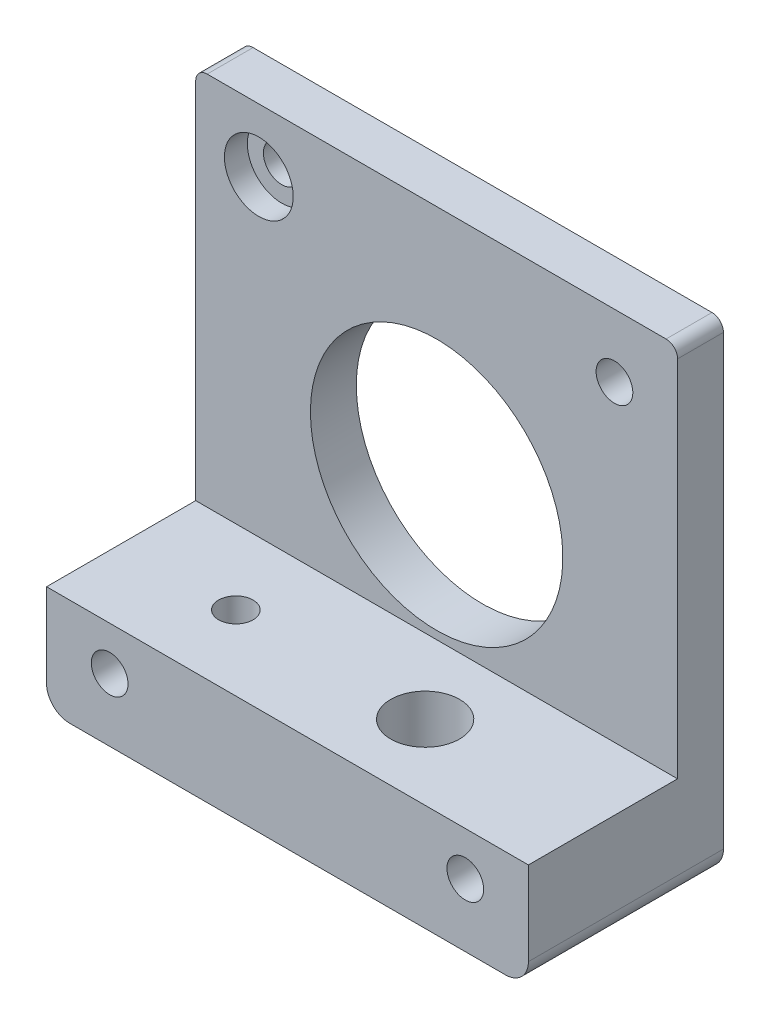
ISO-10303-21;
HEADER;
FILE_DESCRIPTION(('STEP AP214'),'2;1');
FILE_NAME('part.step','',(''),(''),'','','');
FILE_SCHEMA(('AUTOMOTIVE_DESIGN { 1 0 10303 214 1 1 1 1 }'));
ENDSEC;
DATA;
#1=APPLICATION_CONTEXT('core data for automotive mechanical design processes');
#2=APPLICATION_PROTOCOL_DEFINITION('international standard','automotive_design',2000,#1);
#3=PRODUCT_CONTEXT('',#1,'mechanical');
#4=PRODUCT('Part','Part','',(#3));
#5=PRODUCT_RELATED_PRODUCT_CATEGORY('part','',(#4));
#6=PRODUCT_DEFINITION_FORMATION('','',#4);
#7=PRODUCT_DEFINITION_CONTEXT('part definition',#1,'design');
#8=PRODUCT_DEFINITION('design','',#6,#7);
#9=PRODUCT_DEFINITION_SHAPE('','',#8);
#10=(LENGTH_UNIT() NAMED_UNIT(*) SI_UNIT(.MILLI.,.METRE.));
#11=(NAMED_UNIT(*) PLANE_ANGLE_UNIT() SI_UNIT($,.RADIAN.));
#12=(NAMED_UNIT(*) SI_UNIT($,.STERADIAN.) SOLID_ANGLE_UNIT());
#13=UNCERTAINTY_MEASURE_WITH_UNIT(LENGTH_MEASURE(1.E-05),#10,'distance_accuracy_value','');
#14=(GEOMETRIC_REPRESENTATION_CONTEXT(3) GLOBAL_UNCERTAINTY_ASSIGNED_CONTEXT((#13)) GLOBAL_UNIT_ASSIGNED_CONTEXT((#10,
#11,#12)) REPRESENTATION_CONTEXT('',''));
#15=CARTESIAN_POINT('',(0.,0.,0.));
#16=DIRECTION('',(0.,0.,1.));
#17=DIRECTION('',(1.,0.,0.));
#18=AXIS2_PLACEMENT_3D('',#15,#16,#17);
#19=CARTESIAN_POINT('',(17.80322785645,-22.303538170995,8.5));
#20=DIRECTION('',(0.,-1.,0.));
#21=DIRECTION('',(0.,0.,-1.));
#22=AXIS2_PLACEMENT_3D('',#19,#20,#21);
#23=PLANE('',#22);
#24=CARTESIAN_POINT('',(-14.19677214355,-22.303538170995,2.));
#25=DIRECTION('',(0.,-1.,0.));
#26=DIRECTION('',(0.,0.,-1.));
#27=AXIS2_PLACEMENT_3D('',#24,#25,#26);
#28=CIRCLE('',#27,1.49999999999999);
#29=CARTESIAN_POINT('',(-14.19677214355,-22.303538170995,0.500000000000013));
#30=VERTEX_POINT('',#29);
#31=EDGE_CURVE('E423',#30,#30,#28,.T.);
#32=ORIENTED_EDGE('',*,*,#31,.F.);
#33=EDGE_LOOP('',(#32));
#34=FACE_BOUND('',#33,.T.);
#35=CARTESIAN_POINT('',(2.30322785645,-22.303538170995,2.));
#36=DIRECTION('',(0.,-1.,0.));
#37=DIRECTION('',(0.,0.,-1.));
#38=AXIS2_PLACEMENT_3D('',#35,#36,#37);
#39=CIRCLE('',#38,2.99999999999999);
#40=CARTESIAN_POINT('',(2.30322785645,-22.303538170995,-0.999999999999988));
#41=VERTEX_POINT('',#40);
#42=EDGE_CURVE('E172',#41,#41,#39,.T.);
#43=ORIENTED_EDGE('',*,*,#42,.F.);
#44=EDGE_LOOP('',(#43));
#45=FACE_BOUND('',#44,.T.);
#46=DIRECTION('',(-1.,0.,0.));
#47=VECTOR('',#46,1.);
#48=CARTESIAN_POINT('',(17.80322785645,-22.303538170995,8.5));
#49=LINE('',#48,#47);
#50=CARTESIAN_POINT('',(15.80322785645,-22.303538170995,8.5));
#51=VERTEX_POINT('',#50);
#52=CARTESIAN_POINT('',(-22.19677214355,-22.303538170995,8.5));
#53=VERTEX_POINT('',#52);
#54=EDGE_CURVE('E151',#51,#53,#49,.T.);
#55=ORIENTED_EDGE('',*,*,#54,.T.);
#56=DIRECTION('',(0.,0.,-1.));
#57=VECTOR('',#56,1.);
#58=CARTESIAN_POINT('',(-22.19677214355,-22.303538170995,8.5));
#59=LINE('',#58,#57);
#60=CARTESIAN_POINT('',(-22.19677214355,-22.303538170995,-8.5));
#61=VERTEX_POINT('',#60);
#62=EDGE_CURVE('E190',#53,#61,#59,.T.);
#63=ORIENTED_EDGE('',*,*,#62,.T.);
#64=DIRECTION('',(-1.,0.,0.));
#65=VECTOR('',#64,1.);
#66=CARTESIAN_POINT('',(17.80322785645,-22.303538170995,-8.5));
#67=LINE('',#66,#65);
#68=CARTESIAN_POINT('',(15.80322785645,-22.303538170995,-8.5));
#69=VERTEX_POINT('',#68);
#70=EDGE_CURVE('E148',#69,#61,#67,.T.);
#71=ORIENTED_EDGE('',*,*,#70,.F.);
#72=DIRECTION('',(0.,0.,-1.));
#73=VECTOR('',#72,1.);
#74=CARTESIAN_POINT('',(15.80322785645,-22.303538170995,8.5));
#75=LINE('',#74,#73);
#76=EDGE_CURVE('E188',#69,#51,#75,.F.);
#77=ORIENTED_EDGE('',*,*,#76,.T.);
#78=EDGE_LOOP('',(#55,#63,#71,#77));
#79=FACE_BOUND('',#78,.T.);
#80=ADVANCED_FACE('F34',(#34,#45,#79),#23,.T.);
#81=CARTESIAN_POINT('',(17.80322785645,19.696461829005,8.5));
#82=DIRECTION('',(1.,0.,0.));
#83=DIRECTION('',(0.,0.,-1.));
#84=AXIS2_PLACEMENT_3D('',#81,#82,#83);
#85=PLANE('',#84);
#86=DIRECTION('',(0.,-1.,0.));
#87=VECTOR('',#86,1.);
#88=CARTESIAN_POINT('',(17.80322785645,19.696461829005,8.5));
#89=LINE('',#88,#87);
#90=CARTESIAN_POINT('',(17.80322785645,-13.003538170995,8.5));
#91=VERTEX_POINT('',#90);
#92=CARTESIAN_POINT('',(17.80322785645,-20.303538170995,8.5));
#93=VERTEX_POINT('',#92);
#94=EDGE_CURVE('E156',#91,#93,#89,.T.);
#95=ORIENTED_EDGE('',*,*,#94,.T.);
#96=DIRECTION('',(0.,0.,-1.));
#97=VECTOR('',#96,1.);
#98=CARTESIAN_POINT('',(17.80322785645,-20.303538170995,8.5));
#99=LINE('',#98,#97);
#100=CARTESIAN_POINT('',(17.80322785645,-20.303538170995,-8.5));
#101=VERTEX_POINT('',#100);
#102=EDGE_CURVE('E11',#93,#101,#99,.T.);
#103=ORIENTED_EDGE('',*,*,#102,.T.);
#104=DIRECTION('',(0.,-1.,0.));
#105=VECTOR('',#104,1.);
#106=CARTESIAN_POINT('',(17.80322785645,19.696461829005,-8.5));
#107=LINE('',#106,#105);
#108=CARTESIAN_POINT('',(17.80322785645,18.696461829005,-8.5));
#109=VERTEX_POINT('',#108);
#110=EDGE_CURVE('E154',#109,#101,#107,.T.);
#111=ORIENTED_EDGE('',*,*,#110,.F.);
#112=DIRECTION('',(0.,0.,-1.));
#113=VECTOR('',#112,1.);
#114=CARTESIAN_POINT('',(17.80322785645,18.696461829005,8.5));
#115=LINE('',#114,#113);
#116=CARTESIAN_POINT('',(17.80322785645,18.696461829005,-4.5));
#117=VERTEX_POINT('',#116);
#118=EDGE_CURVE('E186',#109,#117,#115,.F.);
#119=ORIENTED_EDGE('',*,*,#118,.T.);
#120=DIRECTION('',(0.,1.,0.));
#121=VECTOR('',#120,1.);
#122=CARTESIAN_POINT('',(17.80322785645,-13.003538170995,-4.5));
#123=LINE('',#122,#121);
#124=CARTESIAN_POINT('',(17.80322785645,-13.003538170995,-4.5));
#125=VERTEX_POINT('',#124);
#126=EDGE_CURVE('E139',#125,#117,#123,.T.);
#127=ORIENTED_EDGE('',*,*,#126,.F.);
#128=DIRECTION('',(0.,0.,-1.));
#129=VECTOR('',#128,1.);
#130=CARTESIAN_POINT('',(17.80322785645,-13.003538170995,8.5));
#131=LINE('',#130,#129);
#132=EDGE_CURVE('E121',#91,#125,#131,.T.);
#133=ORIENTED_EDGE('',*,*,#132,.F.);
#134=EDGE_LOOP('',(#95,#103,#111,#119,#127,#133));
#135=FACE_BOUND('',#134,.T.);
#136=ADVANCED_FACE('F222',(#135),#85,.T.);
#137=CARTESIAN_POINT('',(-24.19677214355,19.696461829005,8.5));
#138=DIRECTION('',(0.,1.,0.));
#139=DIRECTION('',(0.,0.,1.));
#140=AXIS2_PLACEMENT_3D('',#137,#138,#139);
#141=PLANE('',#140);
#142=DIRECTION('',(1.,0.,0.));
#143=VECTOR('',#142,1.);
#144=CARTESIAN_POINT('',(-24.19677214355,19.696461829005,-8.5));
#145=LINE('',#144,#143);
#146=CARTESIAN_POINT('',(-23.19677214355,19.696461829005,-8.5));
#147=VERTEX_POINT('',#146);
#148=CARTESIAN_POINT('',(16.80322785645,19.696461829005,-8.5));
#149=VERTEX_POINT('',#148);
#150=EDGE_CURVE('E163',#147,#149,#145,.T.);
#151=ORIENTED_EDGE('',*,*,#150,.F.);
#152=DIRECTION('',(0.,0.,-1.));
#153=VECTOR('',#152,1.);
#154=CARTESIAN_POINT('',(-23.19677214355,19.696461829005,8.5));
#155=LINE('',#154,#153);
#156=CARTESIAN_POINT('',(-23.19677214355,19.696461829005,-4.5));
#157=VERTEX_POINT('',#156);
#158=EDGE_CURVE('E181',#147,#157,#155,.F.);
#159=ORIENTED_EDGE('',*,*,#158,.T.);
#160=DIRECTION('',(1.,0.,0.));
#161=VECTOR('',#160,1.);
#162=CARTESIAN_POINT('',(-24.19677214355,19.696461829005,-4.5));
#163=LINE('',#162,#161);
#164=CARTESIAN_POINT('',(16.80322785645,19.696461829005,-4.5));
#165=VERTEX_POINT('',#164);
#166=EDGE_CURVE('E125',#157,#165,#163,.T.);
#167=ORIENTED_EDGE('',*,*,#166,.T.);
#168=DIRECTION('',(0.,0.,-1.));
#169=VECTOR('',#168,1.);
#170=CARTESIAN_POINT('',(16.80322785645,19.696461829005,8.5));
#171=LINE('',#170,#169);
#172=EDGE_CURVE('E178',#165,#149,#171,.T.);
#173=ORIENTED_EDGE('',*,*,#172,.T.);
#174=EDGE_LOOP('',(#151,#159,#167,#173));
#175=FACE_BOUND('',#174,.T.);
#176=ADVANCED_FACE('F214',(#175),#141,.T.);
#177=CARTESIAN_POINT('',(-24.19677214355,-22.303538170995,8.5));
#178=DIRECTION('',(-1.,0.,0.));
#179=DIRECTION('',(0.,0.,1.));
#180=AXIS2_PLACEMENT_3D('',#177,#178,#179);
#181=PLANE('',#180);
#182=DIRECTION('',(0.,1.,0.));
#183=VECTOR('',#182,1.);
#184=CARTESIAN_POINT('',(-24.19677214355,-22.303538170995,-8.5));
#185=LINE('',#184,#183);
#186=CARTESIAN_POINT('',(-24.19677214355,-20.303538170995,-8.5));
#187=VERTEX_POINT('',#186);
#188=CARTESIAN_POINT('',(-24.19677214355,18.696461829005,-8.5));
#189=VERTEX_POINT('',#188);
#190=EDGE_CURVE('E161',#187,#189,#185,.T.);
#191=ORIENTED_EDGE('',*,*,#190,.F.);
#192=DIRECTION('',(0.,0.,-1.));
#193=VECTOR('',#192,1.);
#194=CARTESIAN_POINT('',(-24.19677214355,-20.303538170995,8.5));
#195=LINE('',#194,#193);
#196=CARTESIAN_POINT('',(-24.19677214355,-20.303538170995,8.5));
#197=VERTEX_POINT('',#196);
#198=EDGE_CURVE('E57',#187,#197,#195,.F.);
#199=ORIENTED_EDGE('',*,*,#198,.T.);
#200=DIRECTION('',(0.,1.,0.));
#201=VECTOR('',#200,1.);
#202=CARTESIAN_POINT('',(-24.19677214355,-22.303538170995,8.5));
#203=LINE('',#202,#201);
#204=CARTESIAN_POINT('',(-24.19677214355,-13.003538170995,8.5));
#205=VERTEX_POINT('',#204);
#206=EDGE_CURVE('E138',#197,#205,#203,.T.);
#207=ORIENTED_EDGE('',*,*,#206,.T.);
#208=DIRECTION('',(0.,0.,-1.));
#209=VECTOR('',#208,1.);
#210=CARTESIAN_POINT('',(-24.19677214355,-13.003538170995,8.5));
#211=LINE('',#210,#209);
#212=CARTESIAN_POINT('',(-24.19677214355,-13.003538170995,-4.5));
#213=VERTEX_POINT('',#212);
#214=EDGE_CURVE('E118',#205,#213,#211,.T.);
#215=ORIENTED_EDGE('',*,*,#214,.T.);
#216=DIRECTION('',(0.,1.,0.));
#217=VECTOR('',#216,1.);
#218=CARTESIAN_POINT('',(-24.19677214355,-13.003538170995,-4.5));
#219=LINE('',#218,#217);
#220=CARTESIAN_POINT('',(-24.19677214355,18.696461829005,-4.5));
#221=VERTEX_POINT('',#220);
#222=EDGE_CURVE('E129',#213,#221,#219,.T.);
#223=ORIENTED_EDGE('',*,*,#222,.T.);
#224=DIRECTION('',(0.,0.,-1.));
#225=VECTOR('',#224,1.);
#226=CARTESIAN_POINT('',(-24.19677214355,18.696461829005,8.5));
#227=LINE('',#226,#225);
#228=EDGE_CURVE('E158',#221,#189,#227,.T.);
#229=ORIENTED_EDGE('',*,*,#228,.T.);
#230=EDGE_LOOP('',(#191,#199,#207,#215,#223,#229));
#231=FACE_BOUND('',#230,.T.);
#232=ADVANCED_FACE('F137',(#231),#181,.T.);
#233=CARTESIAN_POINT('',(0.,0.,8.5));
#234=DIRECTION('',(0.,0.,-1.));
#235=DIRECTION('',(-1.,0.,0.));
#236=AXIS2_PLACEMENT_3D('',#233,#234,#235);
#237=PLANE('',#236);
#238=CARTESIAN_POINT('',(-18.69677214355,-16.803538170995,8.5));
#239=DIRECTION('',(0.,0.,1.));
#240=DIRECTION('',(1.,0.,0.));
#241=AXIS2_PLACEMENT_3D('',#238,#239,#240);
#242=CIRCLE('',#241,1.59999999999999);
#243=CARTESIAN_POINT('',(-17.09677214355,-16.803538170995,8.5));
#244=VERTEX_POINT('',#243);
#245=EDGE_CURVE('E171',#244,#244,#242,.T.);
#246=ORIENTED_EDGE('',*,*,#245,.F.);
#247=EDGE_LOOP('',(#246));
#248=FACE_BOUND('',#247,.T.);
#249=CARTESIAN_POINT('',(12.30322785645,-16.803538170995,8.5));
#250=DIRECTION('',(0.,0.,1.));
#251=DIRECTION('',(1.,0.,0.));
#252=AXIS2_PLACEMENT_3D('',#249,#250,#251);
#253=CIRCLE('',#252,1.59999999999999);
#254=CARTESIAN_POINT('',(13.90322785645,-16.803538170995,8.5));
#255=VERTEX_POINT('',#254);
#256=EDGE_CURVE('E437',#255,#255,#253,.T.);
#257=ORIENTED_EDGE('',*,*,#256,.F.);
#258=EDGE_LOOP('',(#257));
#259=FACE_BOUND('',#258,.T.);
#260=ORIENTED_EDGE('',*,*,#206,.F.);
#261=CARTESIAN_POINT('',(-22.19677214355,-20.303538170995,8.5));
#262=DIRECTION('',(0.,0.,-1.));
#263=DIRECTION('',(-1.,0.,0.));
#264=AXIS2_PLACEMENT_3D('',#261,#262,#263);
#265=CIRCLE('',#264,2.);
#266=EDGE_CURVE('E42',#197,#53,#265,.F.);
#267=ORIENTED_EDGE('',*,*,#266,.T.);
#268=ORIENTED_EDGE('',*,*,#54,.F.);
#269=CARTESIAN_POINT('',(15.80322785645,-20.303538170995,8.5));
#270=DIRECTION('',(0.,0.,-1.));
#271=DIRECTION('',(-1.,0.,0.));
#272=AXIS2_PLACEMENT_3D('',#269,#270,#271);
#273=CIRCLE('',#272,2.);
#274=EDGE_CURVE('E49',#51,#93,#273,.F.);
#275=ORIENTED_EDGE('',*,*,#274,.T.);
#276=ORIENTED_EDGE('',*,*,#94,.F.);
#277=DIRECTION('',(1.,0.,0.));
#278=VECTOR('',#277,1.);
#279=CARTESIAN_POINT('',(-24.19677214355,-13.003538170995,8.5));
#280=LINE('',#279,#278);
#281=EDGE_CURVE('E126',#205,#91,#280,.T.);
#282=ORIENTED_EDGE('',*,*,#281,.F.);
#283=EDGE_LOOP('',(#260,#267,#268,#275,#276,#282));
#284=FACE_BOUND('',#283,.T.);
#285=ADVANCED_FACE('F199',(#248,#259,#284),#237,.F.);
#286=CARTESIAN_POINT('',(0.,0.,-8.5));
#287=DIRECTION('',(0.,0.,-1.));
#288=DIRECTION('',(-1.,0.,0.));
#289=AXIS2_PLACEMENT_3D('',#286,#287,#288);
#290=PLANE('',#289);
#291=CARTESIAN_POINT('',(-18.69677214355,14.196461829005,-8.5));
#292=DIRECTION('',(0.,0.,1.));
#293=DIRECTION('',(1.,0.,0.));
#294=AXIS2_PLACEMENT_3D('',#291,#292,#293);
#295=CIRCLE('',#294,1.60000000000001);
#296=CARTESIAN_POINT('',(-17.09677214355,14.196461829005,-8.5));
#297=VERTEX_POINT('',#296);
#298=EDGE_CURVE('E428',#297,#297,#295,.T.);
#299=ORIENTED_EDGE('',*,*,#298,.T.);
#300=EDGE_LOOP('',(#299));
#301=FACE_BOUND('',#300,.T.);
#302=CARTESIAN_POINT('',(-18.69677214355,-16.803538170995,-8.5));
#303=DIRECTION('',(0.,0.,1.));
#304=DIRECTION('',(1.,0.,0.));
#305=AXIS2_PLACEMENT_3D('',#302,#303,#304);
#306=CIRCLE('',#305,1.59999999999999);
#307=CARTESIAN_POINT('',(-17.09677214355,-16.803538170995,-8.5));
#308=VERTEX_POINT('',#307);
#309=EDGE_CURVE('E434',#308,#308,#306,.T.);
#310=ORIENTED_EDGE('',*,*,#309,.T.);
#311=EDGE_LOOP('',(#310));
#312=FACE_BOUND('',#311,.T.);
#313=CARTESIAN_POINT('',(12.30322785645,-16.803538170995,-8.5));
#314=DIRECTION('',(0.,0.,1.));
#315=DIRECTION('',(1.,0.,0.));
#316=AXIS2_PLACEMENT_3D('',#313,#314,#315);
#317=CIRCLE('',#316,1.59999999999999);
#318=CARTESIAN_POINT('',(13.90322785645,-16.803538170995,-8.5));
#319=VERTEX_POINT('',#318);
#320=EDGE_CURVE('E440',#319,#319,#317,.T.);
#321=ORIENTED_EDGE('',*,*,#320,.T.);
#322=EDGE_LOOP('',(#321));
#323=FACE_BOUND('',#322,.T.);
#324=CARTESIAN_POINT('',(12.30322785645,14.196461829005,-8.5));
#325=DIRECTION('',(0.,0.,-1.));
#326=DIRECTION('',(-1.,0.,0.));
#327=AXIS2_PLACEMENT_3D('',#324,#325,#326);
#328=CIRCLE('',#327,1.59999999999999);
#329=CARTESIAN_POINT('',(10.70322785645,14.196461829005,-8.5));
#330=VERTEX_POINT('',#329);
#331=EDGE_CURVE('E443',#330,#330,#328,.T.);
#332=ORIENTED_EDGE('',*,*,#331,.F.);
#333=EDGE_LOOP('',(#332));
#334=FACE_BOUND('',#333,.T.);
#335=CARTESIAN_POINT('',(-3.19677214355,-1.303538170995,-8.5));
#336=DIRECTION('',(0.,0.,-1.));
#337=DIRECTION('',(-1.,0.,0.));
#338=AXIS2_PLACEMENT_3D('',#335,#336,#337);
#339=CIRCLE('',#338,11.);
#340=CARTESIAN_POINT('',(-14.19677214355,-1.303538170995,-8.5));
#341=VERTEX_POINT('',#340);
#342=EDGE_CURVE('E448',#341,#341,#339,.T.);
#343=ORIENTED_EDGE('',*,*,#342,.F.);
#344=EDGE_LOOP('',(#343));
#345=FACE_BOUND('',#344,.T.);
#346=ORIENTED_EDGE('',*,*,#70,.T.);
#347=CARTESIAN_POINT('',(-22.19677214355,-20.303538170995,-8.5));
#348=DIRECTION('',(0.,0.,-1.));
#349=DIRECTION('',(-1.,0.,0.));
#350=AXIS2_PLACEMENT_3D('',#347,#348,#349);
#351=CIRCLE('',#350,2.);
#352=EDGE_CURVE('E195',#61,#187,#351,.T.);
#353=ORIENTED_EDGE('',*,*,#352,.T.);
#354=ORIENTED_EDGE('',*,*,#190,.T.);
#355=CARTESIAN_POINT('',(-23.19677214355,18.696461829005,-8.5));
#356=DIRECTION('',(0.,0.,-1.));
#357=DIRECTION('',(-1.,0.,0.));
#358=AXIS2_PLACEMENT_3D('',#355,#356,#357);
#359=CIRCLE('',#358,1.);
#360=EDGE_CURVE('E176',#189,#147,#359,.T.);
#361=ORIENTED_EDGE('',*,*,#360,.T.);
#362=ORIENTED_EDGE('',*,*,#150,.T.);
#363=CARTESIAN_POINT('',(16.80322785645,18.696461829005,-8.5));
#364=DIRECTION('',(0.,0.,-1.));
#365=DIRECTION('',(-1.,0.,0.));
#366=AXIS2_PLACEMENT_3D('',#363,#364,#365);
#367=CIRCLE('',#366,1.);
#368=EDGE_CURVE('E174',#149,#109,#367,.T.);
#369=ORIENTED_EDGE('',*,*,#368,.T.);
#370=ORIENTED_EDGE('',*,*,#110,.T.);
#371=CARTESIAN_POINT('',(15.80322785645,-20.303538170995,-8.5));
#372=DIRECTION('',(0.,0.,-1.));
#373=DIRECTION('',(-1.,0.,0.));
#374=AXIS2_PLACEMENT_3D('',#371,#372,#373);
#375=CIRCLE('',#374,2.);
#376=EDGE_CURVE('E193',#101,#69,#375,.T.);
#377=ORIENTED_EDGE('',*,*,#376,.T.);
#378=EDGE_LOOP('',(#346,#353,#354,#361,#362,#369,#370,#377));
#379=FACE_BOUND('',#378,.T.);
#380=ADVANCED_FACE('F207',(#301,#312,#323,#334,#345,#379),#290,.T.);
#381=CARTESIAN_POINT('',(-24.19677214355,-13.003538170995,-4.5));
#382=DIRECTION('',(0.,0.,-1.));
#383=DIRECTION('',(-1.,0.,0.));
#384=AXIS2_PLACEMENT_3D('',#381,#382,#383);
#385=PLANE('',#384);
#386=CARTESIAN_POINT('',(-18.69677214355,14.196461829005,-4.5));
#387=DIRECTION('',(0.,0.,1.));
#388=DIRECTION('',(1.,0.,0.));
#389=AXIS2_PLACEMENT_3D('',#386,#387,#388);
#390=CIRCLE('',#389,3.);
#391=CARTESIAN_POINT('',(-15.69677214355,14.196461829005,-4.5));
#392=VERTEX_POINT('',#391);
#393=EDGE_CURVE('E478',#392,#392,#390,.T.);
#394=ORIENTED_EDGE('',*,*,#393,.F.);
#395=EDGE_LOOP('',(#394));
#396=FACE_BOUND('',#395,.T.);
#397=CARTESIAN_POINT('',(12.30322785645,14.196461829005,-4.5));
#398=DIRECTION('',(0.,0.,-1.));
#399=DIRECTION('',(-1.,0.,0.));
#400=AXIS2_PLACEMENT_3D('',#397,#398,#399);
#401=CIRCLE('',#400,1.59999999999999);
#402=CARTESIAN_POINT('',(10.70322785645,14.196461829005,-4.5));
#403=VERTEX_POINT('',#402);
#404=EDGE_CURVE('E446',#403,#403,#401,.T.);
#405=ORIENTED_EDGE('',*,*,#404,.T.);
#406=EDGE_LOOP('',(#405));
#407=FACE_BOUND('',#406,.T.);
#408=CARTESIAN_POINT('',(-3.19677214355,-1.303538170995,-4.5));
#409=DIRECTION('',(0.,0.,-1.));
#410=DIRECTION('',(-1.,0.,0.));
#411=AXIS2_PLACEMENT_3D('',#408,#409,#410);
#412=CIRCLE('',#411,11.);
#413=CARTESIAN_POINT('',(-14.19677214355,-1.303538170995,-4.5));
#414=VERTEX_POINT('',#413);
#415=EDGE_CURVE('E143',#414,#414,#412,.T.);
#416=ORIENTED_EDGE('',*,*,#415,.T.);
#417=EDGE_LOOP('',(#416));
#418=FACE_BOUND('',#417,.T.);
#419=ORIENTED_EDGE('',*,*,#166,.F.);
#420=CARTESIAN_POINT('',(-23.19677214355,18.696461829005,-4.5));
#421=DIRECTION('',(0.,0.,-1.));
#422=DIRECTION('',(-1.,0.,0.));
#423=AXIS2_PLACEMENT_3D('',#420,#421,#422);
#424=CIRCLE('',#423,1.);
#425=EDGE_CURVE('E133',#157,#221,#424,.F.);
#426=ORIENTED_EDGE('',*,*,#425,.T.);
#427=ORIENTED_EDGE('',*,*,#222,.F.);
#428=DIRECTION('',(1.,0.,0.));
#429=VECTOR('',#428,1.);
#430=CARTESIAN_POINT('',(-24.19677214355,-13.003538170995,-4.5));
#431=LINE('',#430,#429);
#432=EDGE_CURVE('E114',#213,#125,#431,.T.);
#433=ORIENTED_EDGE('',*,*,#432,.T.);
#434=ORIENTED_EDGE('',*,*,#126,.T.);
#435=CARTESIAN_POINT('',(16.80322785645,18.696461829005,-4.5));
#436=DIRECTION('',(0.,0.,-1.));
#437=DIRECTION('',(-1.,0.,0.));
#438=AXIS2_PLACEMENT_3D('',#435,#436,#437);
#439=CIRCLE('',#438,1.);
#440=EDGE_CURVE('E183',#117,#165,#439,.F.);
#441=ORIENTED_EDGE('',*,*,#440,.T.);
#442=EDGE_LOOP('',(#419,#426,#427,#433,#434,#441));
#443=FACE_BOUND('',#442,.T.);
#444=ADVANCED_FACE('F131',(#396,#407,#418,#443),#385,.F.);
#445=CARTESIAN_POINT('',(-24.19677214355,-13.003538170995,8.5));
#446=DIRECTION('',(0.,-1.,0.));
#447=DIRECTION('',(0.,0.,-1.));
#448=AXIS2_PLACEMENT_3D('',#445,#446,#447);
#449=PLANE('',#448);
#450=CARTESIAN_POINT('',(-14.19677214355,-13.003538170995,2.));
#451=DIRECTION('',(0.,-1.,0.));
#452=DIRECTION('',(0.,0.,-1.));
#453=AXIS2_PLACEMENT_3D('',#450,#451,#452);
#454=CIRCLE('',#453,1.49999999999998);
#455=CARTESIAN_POINT('',(-14.19677214355,-13.003538170995,0.500000000000016));
#456=VERTEX_POINT('',#455);
#457=EDGE_CURVE('E419',#456,#456,#454,.T.);
#458=ORIENTED_EDGE('',*,*,#457,.T.);
#459=EDGE_LOOP('',(#458));
#460=FACE_BOUND('',#459,.T.);
#461=CARTESIAN_POINT('',(2.30322785645,-13.003538170995,2.));
#462=DIRECTION('',(0.,-1.,0.));
#463=DIRECTION('',(0.,0.,-1.));
#464=AXIS2_PLACEMENT_3D('',#461,#462,#463);
#465=CIRCLE('',#464,2.99999999999999);
#466=CARTESIAN_POINT('',(2.30322785645,-13.003538170995,-0.999999999999985));
#467=VERTEX_POINT('',#466);
#468=EDGE_CURVE('E168',#467,#467,#465,.T.);
#469=ORIENTED_EDGE('',*,*,#468,.T.);
#470=EDGE_LOOP('',(#469));
#471=FACE_BOUND('',#470,.T.);
#472=ORIENTED_EDGE('',*,*,#132,.T.);
#473=ORIENTED_EDGE('',*,*,#432,.F.);
#474=ORIENTED_EDGE('',*,*,#214,.F.);
#475=ORIENTED_EDGE('',*,*,#281,.T.);
#476=EDGE_LOOP('',(#472,#473,#474,#475));
#477=FACE_BOUND('',#476,.T.);
#478=ADVANCED_FACE('F116',(#460,#471,#477),#449,.F.);
#479=CARTESIAN_POINT('',(-3.19677214355,-1.303538170995,-8.5));
#480=DIRECTION('',(0.,0.,-1.));
#481=DIRECTION('',(-1.,0.,0.));
#482=AXIS2_PLACEMENT_3D('',#479,#480,#481);
#483=CYLINDRICAL_SURFACE('',#482,11.);
#484=ORIENTED_EDGE('',*,*,#342,.T.);
#485=EDGE_LOOP('',(#484));
#486=FACE_BOUND('',#485,.T.);
#487=ORIENTED_EDGE('',*,*,#415,.F.);
#488=EDGE_LOOP('',(#487));
#489=FACE_BOUND('',#488,.T.);
#490=ADVANCED_FACE('F390',(#486,#489),#483,.F.);
#491=CARTESIAN_POINT('',(12.30322785645,14.196461829005,-8.5));
#492=DIRECTION('',(0.,0.,-1.));
#493=DIRECTION('',(-1.,0.,0.));
#494=AXIS2_PLACEMENT_3D('',#491,#492,#493);
#495=CYLINDRICAL_SURFACE('',#494,1.59999999999999);
#496=ORIENTED_EDGE('',*,*,#331,.T.);
#497=EDGE_LOOP('',(#496));
#498=FACE_BOUND('',#497,.T.);
#499=ORIENTED_EDGE('',*,*,#404,.F.);
#500=EDGE_LOOP('',(#499));
#501=FACE_BOUND('',#500,.T.);
#502=ADVANCED_FACE('F381',(#498,#501),#495,.F.);
#503=CARTESIAN_POINT('',(12.30322785645,-16.803538170995,8.5));
#504=DIRECTION('',(0.,0.,1.));
#505=DIRECTION('',(1.,0.,0.));
#506=AXIS2_PLACEMENT_3D('',#503,#504,#505);
#507=CYLINDRICAL_SURFACE('',#506,1.59999999999999);
#508=ORIENTED_EDGE('',*,*,#320,.F.);
#509=EDGE_LOOP('',(#508));
#510=FACE_BOUND('',#509,.T.);
#511=ORIENTED_EDGE('',*,*,#256,.T.);
#512=EDGE_LOOP('',(#511));
#513=FACE_BOUND('',#512,.T.);
#514=ADVANCED_FACE('F372',(#510,#513),#507,.F.);
#515=CARTESIAN_POINT('',(-18.69677214355,-16.803538170995,8.5));
#516=DIRECTION('',(0.,0.,1.));
#517=DIRECTION('',(1.,0.,0.));
#518=AXIS2_PLACEMENT_3D('',#515,#516,#517);
#519=CYLINDRICAL_SURFACE('',#518,1.59999999999999);
#520=ORIENTED_EDGE('',*,*,#309,.F.);
#521=EDGE_LOOP('',(#520));
#522=FACE_BOUND('',#521,.T.);
#523=ORIENTED_EDGE('',*,*,#245,.T.);
#524=EDGE_LOOP('',(#523));
#525=FACE_BOUND('',#524,.T.);
#526=ADVANCED_FACE('F363',(#522,#525),#519,.F.);
#527=CARTESIAN_POINT('',(2.30322785645,-22.303538170995,2.));
#528=DIRECTION('',(0.,-1.,0.));
#529=DIRECTION('',(0.,0.,-1.));
#530=AXIS2_PLACEMENT_3D('',#527,#528,#529);
#531=CYLINDRICAL_SURFACE('',#530,2.99999999999999);
#532=ORIENTED_EDGE('',*,*,#42,.T.);
#533=EDGE_LOOP('',(#532));
#534=FACE_BOUND('',#533,.T.);
#535=ORIENTED_EDGE('',*,*,#468,.F.);
#536=EDGE_LOOP('',(#535));
#537=FACE_BOUND('',#536,.T.);
#538=ADVANCED_FACE('F353',(#534,#537),#531,.F.);
#539=CARTESIAN_POINT('',(-14.19677214355,-22.303538170995,2.));
#540=DIRECTION('',(0.,-1.,0.));
#541=DIRECTION('',(0.,0.,-1.));
#542=AXIS2_PLACEMENT_3D('',#539,#540,#541);
#543=CYLINDRICAL_SURFACE('',#542,1.49999999999998);
#544=ORIENTED_EDGE('',*,*,#31,.T.);
#545=EDGE_LOOP('',(#544));
#546=FACE_BOUND('',#545,.T.);
#547=ORIENTED_EDGE('',*,*,#457,.F.);
#548=EDGE_LOOP('',(#547));
#549=FACE_BOUND('',#548,.T.);
#550=ADVANCED_FACE('F344',(#546,#549),#543,.F.);
#551=CARTESIAN_POINT('',(-18.69677214355,14.196461829005,-4.5));
#552=DIRECTION('',(0.,0.,1.));
#553=DIRECTION('',(1.,0.,0.));
#554=AXIS2_PLACEMENT_3D('',#551,#552,#553);
#555=CYLINDRICAL_SURFACE('',#554,1.60000000000001);
#556=ORIENTED_EDGE('',*,*,#298,.F.);
#557=EDGE_LOOP('',(#556));
#558=FACE_BOUND('',#557,.T.);
#559=CARTESIAN_POINT('',(-18.69677214355,14.196461829005,-6.5));
#560=DIRECTION('',(0.,0.,1.));
#561=DIRECTION('',(1.,0.,0.));
#562=AXIS2_PLACEMENT_3D('',#559,#560,#561);
#563=CIRCLE('',#562,1.60000000000001);
#564=CARTESIAN_POINT('',(-17.09677214355,14.196461829005,-6.5));
#565=VERTEX_POINT('',#564);
#566=EDGE_CURVE('E472',#565,#565,#563,.T.);
#567=ORIENTED_EDGE('',*,*,#566,.T.);
#568=EDGE_LOOP('',(#567));
#569=FACE_BOUND('',#568,.T.);
#570=ADVANCED_FACE('F335',(#558,#569),#555,.F.);
#571=CARTESIAN_POINT('',(-17.09677214355,14.196461829005,-6.5));
#572=DIRECTION('',(0.,0.,-1.));
#573=DIRECTION('',(-1.,0.,0.));
#574=AXIS2_PLACEMENT_3D('',#571,#572,#573);
#575=PLANE('',#574);
#576=ORIENTED_EDGE('',*,*,#566,.F.);
#577=EDGE_LOOP('',(#576));
#578=FACE_BOUND('',#577,.T.);
#579=CARTESIAN_POINT('',(-18.69677214355,14.196461829005,-6.5));
#580=DIRECTION('',(0.,0.,1.));
#581=DIRECTION('',(1.,0.,0.));
#582=AXIS2_PLACEMENT_3D('',#579,#580,#581);
#583=CIRCLE('',#582,3.);
#584=CARTESIAN_POINT('',(-15.69677214355,14.196461829005,-6.5));
#585=VERTEX_POINT('',#584);
#586=EDGE_CURVE('E475',#585,#585,#583,.T.);
#587=ORIENTED_EDGE('',*,*,#586,.T.);
#588=EDGE_LOOP('',(#587));
#589=FACE_BOUND('',#588,.T.);
#590=ADVANCED_FACE('F328',(#578,#589),#575,.F.);
#591=CARTESIAN_POINT('',(-18.69677214355,14.196461829005,-4.5));
#592=DIRECTION('',(0.,0.,1.));
#593=DIRECTION('',(1.,0.,0.));
#594=AXIS2_PLACEMENT_3D('',#591,#592,#593);
#595=CYLINDRICAL_SURFACE('',#594,3.);
#596=ORIENTED_EDGE('',*,*,#586,.F.);
#597=EDGE_LOOP('',(#596));
#598=FACE_BOUND('',#597,.T.);
#599=ORIENTED_EDGE('',*,*,#393,.T.);
#600=EDGE_LOOP('',(#599));
#601=FACE_BOUND('',#600,.T.);
#602=ADVANCED_FACE('F243',(#598,#601),#595,.F.);
#603=CARTESIAN_POINT('',(-23.19677214355,18.696461829005,8.5));
#604=DIRECTION('',(0.,0.,-1.));
#605=DIRECTION('',(-1.,0.,0.));
#606=AXIS2_PLACEMENT_3D('',#603,#604,#605);
#607=CYLINDRICAL_SURFACE('',#606,1.);
#608=ORIENTED_EDGE('',*,*,#425,.F.);
#609=ORIENTED_EDGE('',*,*,#158,.F.);
#610=ORIENTED_EDGE('',*,*,#360,.F.);
#611=ORIENTED_EDGE('',*,*,#228,.F.);
#612=EDGE_LOOP('',(#608,#609,#610,#611));
#613=FACE_BOUND('',#612,.T.);
#614=ADVANCED_FACE('F210',(#613),#607,.T.);
#615=CARTESIAN_POINT('',(16.80322785645,18.696461829005,8.5));
#616=DIRECTION('',(0.,0.,-1.));
#617=DIRECTION('',(-1.,0.,0.));
#618=AXIS2_PLACEMENT_3D('',#615,#616,#617);
#619=CYLINDRICAL_SURFACE('',#618,1.);
#620=ORIENTED_EDGE('',*,*,#440,.F.);
#621=ORIENTED_EDGE('',*,*,#118,.F.);
#622=ORIENTED_EDGE('',*,*,#368,.F.);
#623=ORIENTED_EDGE('',*,*,#172,.F.);
#624=EDGE_LOOP('',(#620,#621,#622,#623));
#625=FACE_BOUND('',#624,.T.);
#626=ADVANCED_FACE('F218',(#625),#619,.T.);
#627=CARTESIAN_POINT('',(-22.19677214355,-20.303538170995,8.5));
#628=DIRECTION('',(0.,0.,-1.));
#629=DIRECTION('',(-1.,0.,0.));
#630=AXIS2_PLACEMENT_3D('',#627,#628,#629);
#631=CYLINDRICAL_SURFACE('',#630,2.);
#632=ORIENTED_EDGE('',*,*,#266,.F.);
#633=ORIENTED_EDGE('',*,*,#198,.F.);
#634=ORIENTED_EDGE('',*,*,#352,.F.);
#635=ORIENTED_EDGE('',*,*,#62,.F.);
#636=EDGE_LOOP('',(#632,#633,#634,#635));
#637=FACE_BOUND('',#636,.T.);
#638=ADVANCED_FACE('F205',(#637),#631,.T.);
#639=CARTESIAN_POINT('',(15.80322785645,-20.303538170995,8.5));
#640=DIRECTION('',(0.,0.,-1.));
#641=DIRECTION('',(-1.,0.,0.));
#642=AXIS2_PLACEMENT_3D('',#639,#640,#641);
#643=CYLINDRICAL_SURFACE('',#642,2.);
#644=ORIENTED_EDGE('',*,*,#274,.F.);
#645=ORIENTED_EDGE('',*,*,#76,.F.);
#646=ORIENTED_EDGE('',*,*,#376,.F.);
#647=ORIENTED_EDGE('',*,*,#102,.F.);
#648=EDGE_LOOP('',(#644,#645,#646,#647));
#649=FACE_BOUND('',#648,.T.);
#650=ADVANCED_FACE('F36',(#649),#643,.T.);
#651=CLOSED_SHELL('',(#80,#136,#176,#232,#285,#380,#444,#478,#490,#502,#514,#526,#538,#550,#570,
#590,#602,#614,#626,#638,#650));
#652=MANIFOLD_SOLID_BREP('B2',#651);
#653=ADVANCED_BREP_SHAPE_REPRESENTATION('',(#18,#652),#14);
#654=SHAPE_DEFINITION_REPRESENTATION(#9,#653);
ENDSEC;
END-ISO-10303-21;
